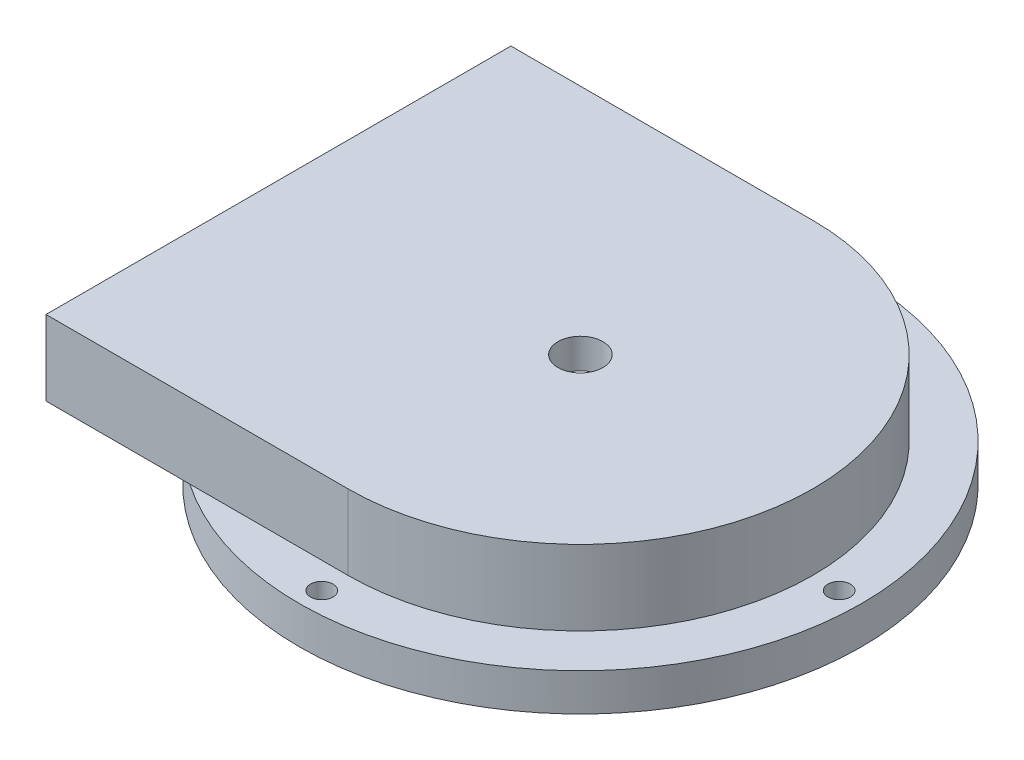
ISO-10303-21;
HEADER;
FILE_DESCRIPTION(('STEP AP214'),'2;1');
FILE_NAME('part.step','',(''),(''),'','','');
FILE_SCHEMA(('AUTOMOTIVE_DESIGN { 1 0 10303 214 1 1 1 1 }'));
ENDSEC;
DATA;
#1=APPLICATION_CONTEXT('core data for automotive mechanical design processes');
#2=APPLICATION_PROTOCOL_DEFINITION('international standard','automotive_design',2000,#1);
#3=PRODUCT_CONTEXT('',#1,'mechanical');
#4=PRODUCT('Part','Part','',(#3));
#5=PRODUCT_RELATED_PRODUCT_CATEGORY('part','',(#4));
#6=PRODUCT_DEFINITION_FORMATION('','',#4);
#7=PRODUCT_DEFINITION_CONTEXT('part definition',#1,'design');
#8=PRODUCT_DEFINITION('design','',#6,#7);
#9=PRODUCT_DEFINITION_SHAPE('','',#8);
#10=(LENGTH_UNIT() NAMED_UNIT(*) SI_UNIT(.MILLI.,.METRE.));
#11=(NAMED_UNIT(*) PLANE_ANGLE_UNIT() SI_UNIT($,.RADIAN.));
#12=(NAMED_UNIT(*) SI_UNIT($,.STERADIAN.) SOLID_ANGLE_UNIT());
#13=UNCERTAINTY_MEASURE_WITH_UNIT(LENGTH_MEASURE(1.E-05),#10,'distance_accuracy_value','');
#14=(GEOMETRIC_REPRESENTATION_CONTEXT(3) GLOBAL_UNCERTAINTY_ASSIGNED_CONTEXT((#13)) GLOBAL_UNIT_ASSIGNED_CONTEXT((#10,
#11,#12)) REPRESENTATION_CONTEXT('',''));
#15=CARTESIAN_POINT('',(0.,0.,0.));
#16=DIRECTION('',(0.,0.,1.));
#17=DIRECTION('',(1.,0.,0.));
#18=AXIS2_PLACEMENT_3D('',#15,#16,#17);
#19=CARTESIAN_POINT('',(0.,5.,0.));
#20=DIRECTION('',(0.,1.,0.));
#21=DIRECTION('',(0.,0.,1.));
#22=AXIS2_PLACEMENT_3D('',#19,#20,#21);
#23=PLANE('',#22);
#24=CARTESIAN_POINT('',(34.5,5.,0.));
#25=DIRECTION('',(0.,1.,0.));
#26=DIRECTION('',(0.,0.,1.));
#27=AXIS2_PLACEMENT_3D('',#24,#25,#26);
#28=CIRCLE('',#27,1.5);
#29=CARTESIAN_POINT('',(34.5,5.,1.5));
#30=VERTEX_POINT('',#29);
#31=EDGE_CURVE('E172',#30,#30,#28,.T.);
#32=ORIENTED_EDGE('',*,*,#31,.F.);
#33=EDGE_LOOP('',(#32));
#34=FACE_BOUND('',#33,.T.);
#35=CARTESIAN_POINT('',(0.,5.,34.5));
#36=DIRECTION('',(0.,1.,0.));
#37=DIRECTION('',(0.,0.,1.));
#38=AXIS2_PLACEMENT_3D('',#35,#36,#37);
#39=CIRCLE('',#38,1.5);
#40=CARTESIAN_POINT('',(0.,5.,36.));
#41=VERTEX_POINT('',#40);
#42=EDGE_CURVE('E166',#41,#41,#39,.T.);
#43=ORIENTED_EDGE('',*,*,#42,.F.);
#44=EDGE_LOOP('',(#43));
#45=FACE_BOUND('',#44,.T.);
#46=CARTESIAN_POINT('',(0.,5.,-34.5));
#47=DIRECTION('',(0.,1.,0.));
#48=DIRECTION('',(0.,0.,1.));
#49=AXIS2_PLACEMENT_3D('',#46,#47,#48);
#50=CIRCLE('',#49,1.50000000000001);
#51=CARTESIAN_POINT('',(0.,5.,-33.));
#52=VERTEX_POINT('',#51);
#53=EDGE_CURVE('E154',#52,#52,#50,.T.);
#54=ORIENTED_EDGE('',*,*,#53,.F.);
#55=EDGE_LOOP('',(#54));
#56=FACE_BOUND('',#55,.T.);
#57=DIRECTION('',(1.,0.,0.));
#58=VECTOR('',#57,1.);
#59=CARTESIAN_POINT('',(0.,5.,31.));
#60=LINE('',#59,#58);
#61=CARTESIAN_POINT('',(-21.1009478460092,5.,31.));
#62=VERTEX_POINT('',#61);
#63=CARTESIAN_POINT('',(0.,5.,31.));
#64=VERTEX_POINT('',#63);
#65=EDGE_CURVE('E12',#62,#64,#60,.T.);
#66=ORIENTED_EDGE('',*,*,#65,.F.);
#67=CARTESIAN_POINT('',(0.,5.,0.));
#68=DIRECTION('',(0.,1.,0.));
#69=DIRECTION('',(0.,0.,1.));
#70=AXIS2_PLACEMENT_3D('',#67,#68,#69);
#71=CIRCLE('',#70,37.5);
#72=CARTESIAN_POINT('',(-21.1009478460092,5.,-31.));
#73=VERTEX_POINT('',#72);
#74=EDGE_CURVE('E120',#62,#73,#71,.T.);
#75=ORIENTED_EDGE('',*,*,#74,.T.);
#76=DIRECTION('',(-1.,0.,0.));
#77=VECTOR('',#76,1.);
#78=CARTESIAN_POINT('',(0.,5.,-31.));
#79=LINE('',#78,#77);
#80=CARTESIAN_POINT('',(0.,5.,-31.));
#81=VERTEX_POINT('',#80);
#82=EDGE_CURVE('E63',#81,#73,#79,.T.);
#83=ORIENTED_EDGE('',*,*,#82,.F.);
#84=CARTESIAN_POINT('',(0.,5.,0.));
#85=DIRECTION('',(0.,1.,0.));
#86=DIRECTION('',(0.,0.,1.));
#87=AXIS2_PLACEMENT_3D('',#84,#85,#86);
#88=CIRCLE('',#87,31.);
#89=EDGE_CURVE('E59',#64,#81,#88,.T.);
#90=ORIENTED_EDGE('',*,*,#89,.F.);
#91=EDGE_LOOP('',(#66,#75,#83,#90));
#92=FACE_BOUND('',#91,.T.);
#93=ADVANCED_FACE('F41',(#34,#45,#56,#92),#23,.T.);
#94=CARTESIAN_POINT('',(0.,0.,0.));
#95=DIRECTION('',(0.,1.,0.));
#96=DIRECTION('',(0.,0.,1.));
#97=AXIS2_PLACEMENT_3D('',#94,#95,#96);
#98=PLANE('',#97);
#99=CARTESIAN_POINT('',(34.5,0.,0.));
#100=DIRECTION('',(0.,1.,0.));
#101=DIRECTION('',(0.,0.,1.));
#102=AXIS2_PLACEMENT_3D('',#99,#100,#101);
#103=CIRCLE('',#102,1.5);
#104=CARTESIAN_POINT('',(34.5,0.,1.5));
#105=VERTEX_POINT('',#104);
#106=EDGE_CURVE('E175',#105,#105,#103,.T.);
#107=ORIENTED_EDGE('',*,*,#106,.T.);
#108=EDGE_LOOP('',(#107));
#109=FACE_BOUND('',#108,.T.);
#110=CARTESIAN_POINT('',(0.,0.,34.5));
#111=DIRECTION('',(0.,1.,0.));
#112=DIRECTION('',(0.,0.,1.));
#113=AXIS2_PLACEMENT_3D('',#110,#111,#112);
#114=CIRCLE('',#113,1.5);
#115=CARTESIAN_POINT('',(0.,0.,36.));
#116=VERTEX_POINT('',#115);
#117=EDGE_CURVE('E169',#116,#116,#114,.T.);
#118=ORIENTED_EDGE('',*,*,#117,.T.);
#119=EDGE_LOOP('',(#118));
#120=FACE_BOUND('',#119,.T.);
#121=CARTESIAN_POINT('',(-34.5,0.,0.));
#122=DIRECTION('',(0.,1.,0.));
#123=DIRECTION('',(0.,0.,1.));
#124=AXIS2_PLACEMENT_3D('',#121,#122,#123);
#125=CIRCLE('',#124,1.5);
#126=CARTESIAN_POINT('',(-34.5,0.,1.5));
#127=VERTEX_POINT('',#126);
#128=EDGE_CURVE('E163',#127,#127,#125,.T.);
#129=ORIENTED_EDGE('',*,*,#128,.T.);
#130=EDGE_LOOP('',(#129));
#131=FACE_BOUND('',#130,.T.);
#132=CARTESIAN_POINT('',(0.,0.,-34.5));
#133=DIRECTION('',(0.,1.,0.));
#134=DIRECTION('',(0.,0.,1.));
#135=AXIS2_PLACEMENT_3D('',#132,#133,#134);
#136=CIRCLE('',#135,1.50000000000001);
#137=CARTESIAN_POINT('',(0.,0.,-33.));
#138=VERTEX_POINT('',#137);
#139=EDGE_CURVE('E157',#138,#138,#136,.T.);
#140=ORIENTED_EDGE('',*,*,#139,.T.);
#141=EDGE_LOOP('',(#140));
#142=FACE_BOUND('',#141,.T.);
#143=CARTESIAN_POINT('',(0.,0.,0.));
#144=DIRECTION('',(0.,1.,0.));
#145=DIRECTION('',(0.,0.,1.));
#146=AXIS2_PLACEMENT_3D('',#143,#144,#145);
#147=CIRCLE('',#146,37.5);
#148=CARTESIAN_POINT('',(0.,0.,37.5));
#149=VERTEX_POINT('',#148);
#150=EDGE_CURVE('E113',#149,#149,#147,.T.);
#151=ORIENTED_EDGE('',*,*,#150,.F.);
#152=EDGE_LOOP('',(#151));
#153=FACE_BOUND('',#152,.T.);
#154=CARTESIAN_POINT('',(0.,0.,0.));
#155=DIRECTION('',(0.,1.,0.));
#156=DIRECTION('',(0.,0.,1.));
#157=AXIS2_PLACEMENT_3D('',#154,#155,#156);
#158=CIRCLE('',#157,27.5);
#159=CARTESIAN_POINT('',(0.,0.,27.5));
#160=VERTEX_POINT('',#159);
#161=EDGE_CURVE('E110',#160,#160,#158,.T.);
#162=ORIENTED_EDGE('',*,*,#161,.T.);
#163=EDGE_LOOP('',(#162));
#164=FACE_BOUND('',#163,.T.);
#165=ADVANCED_FACE('F199',(#109,#120,#131,#142,#153,#164),#98,.F.);
#166=CARTESIAN_POINT('',(0.,5.,0.));
#167=DIRECTION('',(0.,-1.,0.));
#168=DIRECTION('',(0.,0.,-1.));
#169=AXIS2_PLACEMENT_3D('',#166,#167,#168);
#170=CYLINDRICAL_SURFACE('',#169,37.5);
#171=EDGE_CURVE('E50',#73,#62,#71,.T.);
#172=ORIENTED_EDGE('',*,*,#171,.F.);
#173=ORIENTED_EDGE('',*,*,#74,.F.);
#174=EDGE_LOOP('',(#172,#173));
#175=FACE_BOUND('',#174,.T.);
#176=ORIENTED_EDGE('',*,*,#150,.T.);
#177=EDGE_LOOP('',(#176));
#178=FACE_BOUND('',#177,.T.);
#179=ADVANCED_FACE('F43',(#175,#178),#170,.T.);
#180=CARTESIAN_POINT('',(0.,5.,0.));
#181=DIRECTION('',(0.,-1.,0.));
#182=DIRECTION('',(0.,0.,-1.));
#183=AXIS2_PLACEMENT_3D('',#180,#181,#182);
#184=CYLINDRICAL_SURFACE('',#183,27.5);
#185=ORIENTED_EDGE('',*,*,#161,.F.);
#186=EDGE_LOOP('',(#185));
#187=FACE_BOUND('',#186,.T.);
#188=CARTESIAN_POINT('',(0.,11.,0.));
#189=DIRECTION('',(0.,1.,0.));
#190=DIRECTION('',(0.,0.,1.));
#191=AXIS2_PLACEMENT_3D('',#188,#189,#190);
#192=CIRCLE('',#191,27.5);
#193=CARTESIAN_POINT('',(0.,11.,27.5));
#194=VERTEX_POINT('',#193);
#195=EDGE_CURVE('E148',#194,#194,#192,.F.);
#196=ORIENTED_EDGE('',*,*,#195,.F.);
#197=EDGE_LOOP('',(#196));
#198=FACE_BOUND('',#197,.T.);
#199=ADVANCED_FACE('F208',(#187,#198),#184,.F.);
#200=CARTESIAN_POINT('',(0.,15.,0.));
#201=DIRECTION('',(0.,1.,0.));
#202=DIRECTION('',(0.,0.,1.));
#203=AXIS2_PLACEMENT_3D('',#200,#201,#202);
#204=PLANE('',#203);
#205=CARTESIAN_POINT('',(0.,15.,0.));
#206=DIRECTION('',(0.,1.,0.));
#207=DIRECTION('',(0.,0.,1.));
#208=AXIS2_PLACEMENT_3D('',#205,#206,#207);
#209=CIRCLE('',#208,3.);
#210=CARTESIAN_POINT('',(0.,15.,3.));
#211=VERTEX_POINT('',#210);
#212=EDGE_CURVE('E151',#211,#211,#209,.T.);
#213=ORIENTED_EDGE('',*,*,#212,.F.);
#214=EDGE_LOOP('',(#213));
#215=FACE_BOUND('',#214,.T.);
#216=CARTESIAN_POINT('',(0.,15.,0.));
#217=DIRECTION('',(0.,1.,0.));
#218=DIRECTION('',(0.,0.,1.));
#219=AXIS2_PLACEMENT_3D('',#216,#217,#218);
#220=CIRCLE('',#219,31.);
#221=CARTESIAN_POINT('',(0.,15.,31.));
#222=VERTEX_POINT('',#221);
#223=CARTESIAN_POINT('',(0.,15.,-31.));
#224=VERTEX_POINT('',#223);
#225=EDGE_CURVE('E99',#222,#224,#220,.T.);
#226=ORIENTED_EDGE('',*,*,#225,.T.);
#227=DIRECTION('',(-1.,0.,0.));
#228=VECTOR('',#227,1.);
#229=CARTESIAN_POINT('',(0.,15.,-31.));
#230=LINE('',#229,#228);
#231=CARTESIAN_POINT('',(-40.2698505277712,15.,-31.));
#232=VERTEX_POINT('',#231);
#233=EDGE_CURVE('E89',#224,#232,#230,.T.);
#234=ORIENTED_EDGE('',*,*,#233,.T.);
#235=DIRECTION('',(0.,0.,1.));
#236=VECTOR('',#235,1.);
#237=CARTESIAN_POINT('',(-40.2698505277712,15.,-31.));
#238=LINE('',#237,#236);
#239=CARTESIAN_POINT('',(-40.2698505277712,15.,31.));
#240=VERTEX_POINT('',#239);
#241=EDGE_CURVE('E98',#232,#240,#238,.T.);
#242=ORIENTED_EDGE('',*,*,#241,.T.);
#243=DIRECTION('',(1.,0.,0.));
#244=VECTOR('',#243,1.);
#245=CARTESIAN_POINT('',(0.,15.,31.));
#246=LINE('',#245,#244);
#247=EDGE_CURVE('E104',#240,#222,#246,.T.);
#248=ORIENTED_EDGE('',*,*,#247,.T.);
#249=EDGE_LOOP('',(#226,#234,#242,#248));
#250=FACE_BOUND('',#249,.T.);
#251=ADVANCED_FACE('F102',(#215,#250),#204,.T.);
#252=CARTESIAN_POINT('',(0.,15.,31.));
#253=DIRECTION('',(0.,0.,-1.));
#254=DIRECTION('',(-1.,0.,0.));
#255=AXIS2_PLACEMENT_3D('',#252,#253,#254);
#256=PLANE('',#255);
#257=CARTESIAN_POINT('',(-40.2698505277712,5.,31.));
#258=VERTEX_POINT('',#257);
#259=EDGE_CURVE('E52',#258,#62,#60,.T.);
#260=ORIENTED_EDGE('',*,*,#259,.T.);
#261=ORIENTED_EDGE('',*,*,#65,.T.);
#262=DIRECTION('',(0.,-1.,0.));
#263=VECTOR('',#262,1.);
#264=CARTESIAN_POINT('',(0.,15.,31.));
#265=LINE('',#264,#263);
#266=EDGE_CURVE('E139',#222,#64,#265,.T.);
#267=ORIENTED_EDGE('',*,*,#266,.F.);
#268=ORIENTED_EDGE('',*,*,#247,.F.);
#269=DIRECTION('',(0.,-1.,0.));
#270=VECTOR('',#269,1.);
#271=CARTESIAN_POINT('',(-40.2698505277712,15.,31.));
#272=LINE('',#271,#270);
#273=EDGE_CURVE('E115',#240,#258,#272,.T.);
#274=ORIENTED_EDGE('',*,*,#273,.T.);
#275=EDGE_LOOP('',(#260,#261,#267,#268,#274));
#276=FACE_BOUND('',#275,.T.);
#277=ADVANCED_FACE('F143',(#276),#256,.F.);
#278=CARTESIAN_POINT('',(-40.2698505277712,15.,-31.));
#279=DIRECTION('',(1.,0.,0.));
#280=DIRECTION('',(0.,0.,-1.));
#281=AXIS2_PLACEMENT_3D('',#278,#279,#280);
#282=PLANE('',#281);
#283=DIRECTION('',(0.,0.,1.));
#284=VECTOR('',#283,1.);
#285=CARTESIAN_POINT('',(-40.2698505277712,5.,-31.));
#286=LINE('',#285,#284);
#287=CARTESIAN_POINT('',(-40.2698505277712,5.,-31.));
#288=VERTEX_POINT('',#287);
#289=EDGE_CURVE('E133',#288,#258,#286,.T.);
#290=ORIENTED_EDGE('',*,*,#289,.T.);
#291=ORIENTED_EDGE('',*,*,#273,.F.);
#292=ORIENTED_EDGE('',*,*,#241,.F.);
#293=DIRECTION('',(0.,-1.,0.));
#294=VECTOR('',#293,1.);
#295=CARTESIAN_POINT('',(-40.2698505277712,15.,-31.));
#296=LINE('',#295,#294);
#297=EDGE_CURVE('E95',#232,#288,#296,.T.);
#298=ORIENTED_EDGE('',*,*,#297,.T.);
#299=EDGE_LOOP('',(#290,#291,#292,#298));
#300=FACE_BOUND('',#299,.T.);
#301=ADVANCED_FACE('F145',(#300),#282,.F.);
#302=CARTESIAN_POINT('',(0.,15.,-31.));
#303=DIRECTION('',(0.,0.,1.));
#304=DIRECTION('',(1.,0.,0.));
#305=AXIS2_PLACEMENT_3D('',#302,#303,#304);
#306=PLANE('',#305);
#307=ORIENTED_EDGE('',*,*,#82,.T.);
#308=EDGE_CURVE('E129',#73,#288,#79,.T.);
#309=ORIENTED_EDGE('',*,*,#308,.T.);
#310=ORIENTED_EDGE('',*,*,#297,.F.);
#311=ORIENTED_EDGE('',*,*,#233,.F.);
#312=DIRECTION('',(0.,-1.,0.));
#313=VECTOR('',#312,1.);
#314=CARTESIAN_POINT('',(0.,15.,-31.));
#315=LINE('',#314,#313);
#316=EDGE_CURVE('E93',#224,#81,#315,.T.);
#317=ORIENTED_EDGE('',*,*,#316,.T.);
#318=EDGE_LOOP('',(#307,#309,#310,#311,#317));
#319=FACE_BOUND('',#318,.T.);
#320=ADVANCED_FACE('F91',(#319),#306,.F.);
#321=CARTESIAN_POINT('',(0.,15.,0.));
#322=DIRECTION('',(0.,-1.,0.));
#323=DIRECTION('',(0.,0.,-1.));
#324=AXIS2_PLACEMENT_3D('',#321,#322,#323);
#325=CYLINDRICAL_SURFACE('',#324,31.);
#326=ORIENTED_EDGE('',*,*,#89,.T.);
#327=ORIENTED_EDGE('',*,*,#316,.F.);
#328=ORIENTED_EDGE('',*,*,#225,.F.);
#329=ORIENTED_EDGE('',*,*,#266,.T.);
#330=EDGE_LOOP('',(#326,#327,#328,#329));
#331=FACE_BOUND('',#330,.T.);
#332=ADVANCED_FACE('F109',(#331),#325,.T.);
#333=CARTESIAN_POINT('',(0.,5.,0.));
#334=DIRECTION('',(0.,1.,0.));
#335=DIRECTION('',(0.,0.,1.));
#336=AXIS2_PLACEMENT_3D('',#333,#334,#335);
#337=PLANE('',#336);
#338=ORIENTED_EDGE('',*,*,#308,.F.);
#339=ORIENTED_EDGE('',*,*,#171,.T.);
#340=ORIENTED_EDGE('',*,*,#259,.F.);
#341=ORIENTED_EDGE('',*,*,#289,.F.);
#342=EDGE_LOOP('',(#338,#339,#340,#341));
#343=FACE_BOUND('',#342,.T.);
#344=ADVANCED_FACE('F130',(#343),#337,.F.);
#345=CARTESIAN_POINT('',(0.,11.,0.));
#346=DIRECTION('',(0.,1.,0.));
#347=DIRECTION('',(0.,0.,1.));
#348=AXIS2_PLACEMENT_3D('',#345,#346,#347);
#349=PLANE('',#348);
#350=CARTESIAN_POINT('',(0.,11.,0.));
#351=DIRECTION('',(0.,1.,0.));
#352=DIRECTION('',(0.,0.,1.));
#353=AXIS2_PLACEMENT_3D('',#350,#351,#352);
#354=CIRCLE('',#353,3.);
#355=CARTESIAN_POINT('',(0.,11.,3.));
#356=VERTEX_POINT('',#355);
#357=EDGE_CURVE('E45',#356,#356,#354,.T.);
#358=ORIENTED_EDGE('',*,*,#357,.T.);
#359=EDGE_LOOP('',(#358));
#360=FACE_BOUND('',#359,.T.);
#361=ORIENTED_EDGE('',*,*,#195,.T.);
#362=EDGE_LOOP('',(#361));
#363=FACE_BOUND('',#362,.T.);
#364=ADVANCED_FACE('F182',(#360,#363),#349,.F.);
#365=CARTESIAN_POINT('',(0.,0.,0.));
#366=DIRECTION('',(0.,1.,0.));
#367=DIRECTION('',(0.,0.,1.));
#368=AXIS2_PLACEMENT_3D('',#365,#366,#367);
#369=CYLINDRICAL_SURFACE('',#368,3.);
#370=ORIENTED_EDGE('',*,*,#212,.T.);
#371=EDGE_LOOP('',(#370));
#372=FACE_BOUND('',#371,.T.);
#373=ORIENTED_EDGE('',*,*,#357,.F.);
#374=EDGE_LOOP('',(#373));
#375=FACE_BOUND('',#374,.T.);
#376=ADVANCED_FACE('F185',(#372,#375),#369,.F.);
#377=CARTESIAN_POINT('',(0.,0.,-34.5));
#378=DIRECTION('',(0.,1.,0.));
#379=DIRECTION('',(0.,0.,1.));
#380=AXIS2_PLACEMENT_3D('',#377,#378,#379);
#381=CYLINDRICAL_SURFACE('',#380,1.50000000000001);
#382=ORIENTED_EDGE('',*,*,#139,.F.);
#383=EDGE_LOOP('',(#382));
#384=FACE_BOUND('',#383,.T.);
#385=ORIENTED_EDGE('',*,*,#53,.T.);
#386=EDGE_LOOP('',(#385));
#387=FACE_BOUND('',#386,.T.);
#388=ADVANCED_FACE('F187',(#384,#387),#381,.F.);
#389=CARTESIAN_POINT('',(-34.5,0.,0.));
#390=DIRECTION('',(0.,1.,0.));
#391=DIRECTION('',(0.,0.,1.));
#392=AXIS2_PLACEMENT_3D('',#389,#390,#391);
#393=CYLINDRICAL_SURFACE('',#392,1.5);
#394=ORIENTED_EDGE('',*,*,#128,.F.);
#395=EDGE_LOOP('',(#394));
#396=FACE_BOUND('',#395,.T.);
#397=CARTESIAN_POINT('',(-34.5,5.,0.));
#398=DIRECTION('',(0.,1.,0.));
#399=DIRECTION('',(0.,0.,1.));
#400=AXIS2_PLACEMENT_3D('',#397,#398,#399);
#401=CIRCLE('',#400,1.5);
#402=CARTESIAN_POINT('',(-34.5,5.,1.5));
#403=VERTEX_POINT('',#402);
#404=EDGE_CURVE('E160',#403,#403,#401,.T.);
#405=ORIENTED_EDGE('',*,*,#404,.T.);
#406=EDGE_LOOP('',(#405));
#407=FACE_BOUND('',#406,.T.);
#408=ADVANCED_FACE('F194',(#396,#407),#393,.F.);
#409=CARTESIAN_POINT('',(-34.5,5.,0.));
#410=DIRECTION('',(0.,1.,0.));
#411=DIRECTION('',(0.,0.,1.));
#412=AXIS2_PLACEMENT_3D('',#409,#410,#411);
#413=PLANE('',#412);
#414=ORIENTED_EDGE('',*,*,#404,.F.);
#415=EDGE_LOOP('',(#414));
#416=FACE_BOUND('',#415,.T.);
#417=ADVANCED_FACE('F275',(#416),#413,.F.);
#418=CARTESIAN_POINT('',(0.,0.,34.5));
#419=DIRECTION('',(0.,1.,0.));
#420=DIRECTION('',(0.,0.,1.));
#421=AXIS2_PLACEMENT_3D('',#418,#419,#420);
#422=CYLINDRICAL_SURFACE('',#421,1.5);
#423=ORIENTED_EDGE('',*,*,#117,.F.);
#424=EDGE_LOOP('',(#423));
#425=FACE_BOUND('',#424,.T.);
#426=ORIENTED_EDGE('',*,*,#42,.T.);
#427=EDGE_LOOP('',(#426));
#428=FACE_BOUND('',#427,.T.);
#429=ADVANCED_FACE('F284',(#425,#428),#422,.F.);
#430=CARTESIAN_POINT('',(34.5,0.,0.));
#431=DIRECTION('',(0.,1.,0.));
#432=DIRECTION('',(0.,0.,1.));
#433=AXIS2_PLACEMENT_3D('',#430,#431,#432);
#434=CYLINDRICAL_SURFACE('',#433,1.5);
#435=ORIENTED_EDGE('',*,*,#106,.F.);
#436=EDGE_LOOP('',(#435));
#437=FACE_BOUND('',#436,.T.);
#438=ORIENTED_EDGE('',*,*,#31,.T.);
#439=EDGE_LOOP('',(#438));
#440=FACE_BOUND('',#439,.T.);
#441=ADVANCED_FACE('F293',(#437,#440),#434,.F.);
#442=CLOSED_SHELL('',(#93,#165,#179,#199,#251,#277,#301,#320,#332,#344,#364,#376,#388,#408,#417,
#429,#441));
#443=MANIFOLD_SOLID_BREP('B2',#442);
#444=ADVANCED_BREP_SHAPE_REPRESENTATION('',(#18,#443),#14);
#445=SHAPE_DEFINITION_REPRESENTATION(#9,#444);
ENDSEC;
END-ISO-10303-21;
